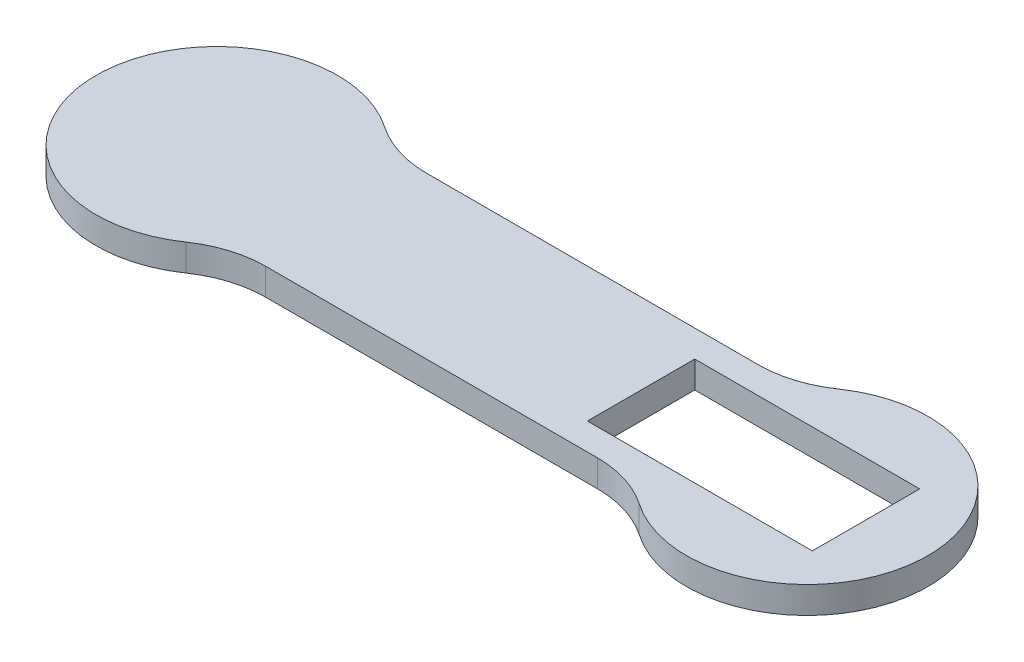
ISO-10303-21;
HEADER;
FILE_DESCRIPTION(('STEP AP214'),'2;1');
FILE_NAME('part.step','',(''),(''),'','','');
FILE_SCHEMA(('AUTOMOTIVE_DESIGN { 1 0 10303 214 1 1 1 1 }'));
ENDSEC;
DATA;
#1=APPLICATION_CONTEXT('core data for automotive mechanical design processes');
#2=APPLICATION_PROTOCOL_DEFINITION('international standard','automotive_design',2000,#1);
#3=PRODUCT_CONTEXT('',#1,'mechanical');
#4=PRODUCT('Part','Part','',(#3));
#5=PRODUCT_RELATED_PRODUCT_CATEGORY('part','',(#4));
#6=PRODUCT_DEFINITION_FORMATION('','',#4);
#7=PRODUCT_DEFINITION_CONTEXT('part definition',#1,'design');
#8=PRODUCT_DEFINITION('design','',#6,#7);
#9=PRODUCT_DEFINITION_SHAPE('','',#8);
#10=(LENGTH_UNIT() NAMED_UNIT(*) SI_UNIT(.MILLI.,.METRE.));
#11=(NAMED_UNIT(*) PLANE_ANGLE_UNIT() SI_UNIT($,.RADIAN.));
#12=(NAMED_UNIT(*) SI_UNIT($,.STERADIAN.) SOLID_ANGLE_UNIT());
#13=UNCERTAINTY_MEASURE_WITH_UNIT(LENGTH_MEASURE(1.E-05),#10,'distance_accuracy_value','');
#14=(GEOMETRIC_REPRESENTATION_CONTEXT(3) GLOBAL_UNCERTAINTY_ASSIGNED_CONTEXT((#13)) GLOBAL_UNIT_ASSIGNED_CONTEXT((#10,
#11,#12)) REPRESENTATION_CONTEXT('',''));
#15=CARTESIAN_POINT('',(0.,0.,0.));
#16=DIRECTION('',(0.,0.,1.));
#17=DIRECTION('',(1.,0.,0.));
#18=AXIS2_PLACEMENT_3D('',#15,#16,#17);
#19=CARTESIAN_POINT('',(85.8908730975176,5.,35.));
#20=DIRECTION('',(0.,-1.,0.));
#21=DIRECTION('',(0.,0.,-1.));
#22=AXIS2_PLACEMENT_3D('',#19,#20,#21);
#23=CYLINDRICAL_SURFACE('',#22,20.);
#24=CARTESIAN_POINT('',(85.8908730975176,0.,35.));
#25=DIRECTION('',(0.,-1.,0.));
#26=DIRECTION('',(0.,0.,1.));
#27=AXIS2_PLACEMENT_3D('',#24,#25,#26);
#28=CIRCLE('',#27,20.);
#29=CARTESIAN_POINT('',(85.8908730975176,0.,15.));
#30=VERTEX_POINT('',#29);
#31=CARTESIAN_POINT('',(97.2363445810388,0.,18.5294117647059));
#32=VERTEX_POINT('',#31);
#33=EDGE_CURVE('E153',#30,#32,#28,.T.);
#34=ORIENTED_EDGE('',*,*,#33,.T.);
#35=DIRECTION('',(0.,-1.,0.));
#36=VECTOR('',#35,1.);
#37=CARTESIAN_POINT('',(97.2363445810388,5.,18.5294117647059));
#38=LINE('',#37,#36);
#39=CARTESIAN_POINT('',(97.2363445810388,5.,18.5294117647059));
#40=VERTEX_POINT('',#39);
#41=EDGE_CURVE('E11',#40,#32,#38,.T.);
#42=ORIENTED_EDGE('',*,*,#41,.F.);
#43=CARTESIAN_POINT('',(85.8908730975176,5.,35.));
#44=DIRECTION('',(0.,-1.,0.));
#45=DIRECTION('',(0.,0.,1.));
#46=AXIS2_PLACEMENT_3D('',#43,#44,#45);
#47=CIRCLE('',#46,20.);
#48=CARTESIAN_POINT('',(85.8908730975176,5.,15.));
#49=VERTEX_POINT('',#48);
#50=EDGE_CURVE('E157',#49,#40,#47,.T.);
#51=ORIENTED_EDGE('',*,*,#50,.F.);
#52=DIRECTION('',(0.,-1.,0.));
#53=VECTOR('',#52,1.);
#54=CARTESIAN_POINT('',(85.8908730975176,5.,15.));
#55=LINE('',#54,#53);
#56=EDGE_CURVE('E175',#49,#30,#55,.T.);
#57=ORIENTED_EDGE('',*,*,#56,.T.);
#58=EDGE_LOOP('',(#34,#42,#51,#57));
#59=FACE_BOUND('',#58,.T.);
#60=ADVANCED_FACE('F34',(#59),#23,.F.);
#61=CARTESIAN_POINT('',(110.,5.,0.));
#62=DIRECTION('',(0.,-1.,0.));
#63=DIRECTION('',(0.,0.,-1.));
#64=AXIS2_PLACEMENT_3D('',#61,#62,#63);
#65=CYLINDRICAL_SURFACE('',#64,22.5);
#66=CARTESIAN_POINT('',(110.,0.,0.));
#67=DIRECTION('',(0.,1.,0.));
#68=DIRECTION('',(0.,0.,1.));
#69=AXIS2_PLACEMENT_3D('',#66,#67,#68);
#70=CIRCLE('',#69,22.5);
#71=CARTESIAN_POINT('',(97.2363445810388,0.,-18.5294117647059));
#72=VERTEX_POINT('',#71);
#73=EDGE_CURVE('E178',#32,#72,#70,.T.);
#74=ORIENTED_EDGE('',*,*,#73,.T.);
#75=DIRECTION('',(0.,-1.,0.));
#76=VECTOR('',#75,1.);
#77=CARTESIAN_POINT('',(97.2363445810388,5.,-18.5294117647059));
#78=LINE('',#77,#76);
#79=CARTESIAN_POINT('',(97.2363445810388,5.,-18.5294117647059));
#80=VERTEX_POINT('',#79);
#81=EDGE_CURVE('E41',#80,#72,#78,.T.);
#82=ORIENTED_EDGE('',*,*,#81,.F.);
#83=CARTESIAN_POINT('',(110.,5.,0.));
#84=DIRECTION('',(0.,1.,0.));
#85=DIRECTION('',(0.,0.,1.));
#86=AXIS2_PLACEMENT_3D('',#83,#84,#85);
#87=CIRCLE('',#86,22.5);
#88=EDGE_CURVE('E160',#40,#80,#87,.T.);
#89=ORIENTED_EDGE('',*,*,#88,.F.);
#90=ORIENTED_EDGE('',*,*,#41,.T.);
#91=EDGE_LOOP('',(#74,#82,#89,#90));
#92=FACE_BOUND('',#91,.T.);
#93=ADVANCED_FACE('F233',(#92),#65,.T.);
#94=CARTESIAN_POINT('',(85.8908730975176,5.,-35.));
#95=DIRECTION('',(0.,-1.,0.));
#96=DIRECTION('',(0.,0.,-1.));
#97=AXIS2_PLACEMENT_3D('',#94,#95,#96);
#98=CYLINDRICAL_SURFACE('',#97,20.);
#99=CARTESIAN_POINT('',(85.8908730975176,0.,-35.));
#100=DIRECTION('',(0.,-1.,0.));
#101=DIRECTION('',(0.,0.,-1.));
#102=AXIS2_PLACEMENT_3D('',#99,#100,#101);
#103=CIRCLE('',#102,20.);
#104=CARTESIAN_POINT('',(85.8908730975176,0.,-15.));
#105=VERTEX_POINT('',#104);
#106=EDGE_CURVE('E180',#72,#105,#103,.T.);
#107=ORIENTED_EDGE('',*,*,#106,.T.);
#108=DIRECTION('',(0.,-1.,0.));
#109=VECTOR('',#108,1.);
#110=CARTESIAN_POINT('',(85.8908730975176,5.,-15.));
#111=LINE('',#110,#109);
#112=CARTESIAN_POINT('',(85.8908730975176,5.,-15.));
#113=VERTEX_POINT('',#112);
#114=EDGE_CURVE('E205',#113,#105,#111,.T.);
#115=ORIENTED_EDGE('',*,*,#114,.F.);
#116=CARTESIAN_POINT('',(85.8908730975176,5.,-35.));
#117=DIRECTION('',(0.,-1.,0.));
#118=DIRECTION('',(0.,0.,-1.));
#119=AXIS2_PLACEMENT_3D('',#116,#117,#118);
#120=CIRCLE('',#119,20.);
#121=EDGE_CURVE('E163',#80,#113,#120,.T.);
#122=ORIENTED_EDGE('',*,*,#121,.F.);
#123=ORIENTED_EDGE('',*,*,#81,.T.);
#124=EDGE_LOOP('',(#107,#115,#122,#123));
#125=FACE_BOUND('',#124,.T.);
#126=ADVANCED_FACE('F212',(#125),#98,.F.);
#127=CARTESIAN_POINT('',(24.1091269024824,5.,-15.));
#128=DIRECTION('',(0.,0.,1.));
#129=DIRECTION('',(1.,0.,0.));
#130=AXIS2_PLACEMENT_3D('',#127,#128,#129);
#131=PLANE('',#130);
#132=DIRECTION('',(-1.,0.,0.));
#133=VECTOR('',#132,1.);
#134=CARTESIAN_POINT('',(24.1091269024824,0.,-15.));
#135=LINE('',#134,#133);
#136=CARTESIAN_POINT('',(24.1091269024824,0.,-15.));
#137=VERTEX_POINT('',#136);
#138=EDGE_CURVE('E182',#105,#137,#135,.T.);
#139=ORIENTED_EDGE('',*,*,#138,.T.);
#140=DIRECTION('',(0.,-1.,0.));
#141=VECTOR('',#140,1.);
#142=CARTESIAN_POINT('',(24.1091269024824,5.,-15.));
#143=LINE('',#142,#141);
#144=CARTESIAN_POINT('',(24.1091269024824,5.,-15.));
#145=VERTEX_POINT('',#144);
#146=EDGE_CURVE('E202',#145,#137,#143,.T.);
#147=ORIENTED_EDGE('',*,*,#146,.F.);
#148=DIRECTION('',(-1.,0.,0.));
#149=VECTOR('',#148,1.);
#150=CARTESIAN_POINT('',(24.1091269024824,5.,-15.));
#151=LINE('',#150,#149);
#152=EDGE_CURVE('E165',#113,#145,#151,.T.);
#153=ORIENTED_EDGE('',*,*,#152,.F.);
#154=ORIENTED_EDGE('',*,*,#114,.T.);
#155=EDGE_LOOP('',(#139,#147,#153,#154));
#156=FACE_BOUND('',#155,.T.);
#157=ADVANCED_FACE('F221',(#156),#131,.F.);
#158=CARTESIAN_POINT('',(24.1091269024824,5.,-35.));
#159=DIRECTION('',(0.,-1.,0.));
#160=DIRECTION('',(0.,0.,-1.));
#161=AXIS2_PLACEMENT_3D('',#158,#159,#160);
#162=CYLINDRICAL_SURFACE('',#161,20.);
#163=CARTESIAN_POINT('',(24.1091269024824,0.,-35.));
#164=DIRECTION('',(0.,-1.,0.));
#165=DIRECTION('',(0.,0.,-1.));
#166=AXIS2_PLACEMENT_3D('',#163,#164,#165);
#167=CIRCLE('',#166,20.);
#168=CARTESIAN_POINT('',(12.7636554189613,0.,-18.5294117647059));
#169=VERTEX_POINT('',#168);
#170=EDGE_CURVE('E184',#137,#169,#167,.T.);
#171=ORIENTED_EDGE('',*,*,#170,.T.);
#172=DIRECTION('',(0.,-1.,0.));
#173=VECTOR('',#172,1.);
#174=CARTESIAN_POINT('',(12.7636554189613,5.,-18.5294117647059));
#175=LINE('',#174,#173);
#176=CARTESIAN_POINT('',(12.7636554189613,5.,-18.5294117647059));
#177=VERTEX_POINT('',#176);
#178=EDGE_CURVE('E199',#177,#169,#175,.T.);
#179=ORIENTED_EDGE('',*,*,#178,.F.);
#180=CARTESIAN_POINT('',(24.1091269024824,5.,-35.));
#181=DIRECTION('',(0.,-1.,0.));
#182=DIRECTION('',(0.,0.,-1.));
#183=AXIS2_PLACEMENT_3D('',#180,#181,#182);
#184=CIRCLE('',#183,20.);
#185=EDGE_CURVE('E167',#145,#177,#184,.T.);
#186=ORIENTED_EDGE('',*,*,#185,.F.);
#187=ORIENTED_EDGE('',*,*,#146,.T.);
#188=EDGE_LOOP('',(#171,#179,#186,#187));
#189=FACE_BOUND('',#188,.T.);
#190=ADVANCED_FACE('F225',(#189),#162,.F.);
#191=CARTESIAN_POINT('',(0.,5.,0.));
#192=DIRECTION('',(0.,-1.,0.));
#193=DIRECTION('',(0.,0.,-1.));
#194=AXIS2_PLACEMENT_3D('',#191,#192,#193);
#195=CYLINDRICAL_SURFACE('',#194,22.5);
#196=CARTESIAN_POINT('',(0.,0.,0.));
#197=DIRECTION('',(0.,1.,0.));
#198=DIRECTION('',(0.,0.,1.));
#199=AXIS2_PLACEMENT_3D('',#196,#197,#198);
#200=CIRCLE('',#199,22.5);
#201=CARTESIAN_POINT('',(12.7636554189613,0.,18.5294117647059));
#202=VERTEX_POINT('',#201);
#203=EDGE_CURVE('E186',#169,#202,#200,.T.);
#204=ORIENTED_EDGE('',*,*,#203,.T.);
#205=DIRECTION('',(0.,-1.,0.));
#206=VECTOR('',#205,1.);
#207=CARTESIAN_POINT('',(12.7636554189613,5.,18.5294117647059));
#208=LINE('',#207,#206);
#209=CARTESIAN_POINT('',(12.7636554189613,5.,18.5294117647059));
#210=VERTEX_POINT('',#209);
#211=EDGE_CURVE('E196',#210,#202,#208,.T.);
#212=ORIENTED_EDGE('',*,*,#211,.F.);
#213=CARTESIAN_POINT('',(0.,5.,0.));
#214=DIRECTION('',(0.,1.,0.));
#215=DIRECTION('',(0.,0.,1.));
#216=AXIS2_PLACEMENT_3D('',#213,#214,#215);
#217=CIRCLE('',#216,22.5);
#218=EDGE_CURVE('E169',#177,#210,#217,.T.);
#219=ORIENTED_EDGE('',*,*,#218,.F.);
#220=ORIENTED_EDGE('',*,*,#178,.T.);
#221=EDGE_LOOP('',(#204,#212,#219,#220));
#222=FACE_BOUND('',#221,.T.);
#223=ADVANCED_FACE('F246',(#222),#195,.T.);
#224=CARTESIAN_POINT('',(24.1091269024824,5.,35.));
#225=DIRECTION('',(0.,-1.,0.));
#226=DIRECTION('',(0.,0.,-1.));
#227=AXIS2_PLACEMENT_3D('',#224,#225,#226);
#228=CYLINDRICAL_SURFACE('',#227,20.);
#229=CARTESIAN_POINT('',(24.1091269024824,0.,35.));
#230=DIRECTION('',(0.,-1.,0.));
#231=DIRECTION('',(0.,0.,1.));
#232=AXIS2_PLACEMENT_3D('',#229,#230,#231);
#233=CIRCLE('',#232,20.);
#234=CARTESIAN_POINT('',(24.1091269024824,0.,15.));
#235=VERTEX_POINT('',#234);
#236=EDGE_CURVE('E188',#202,#235,#233,.T.);
#237=ORIENTED_EDGE('',*,*,#236,.T.);
#238=DIRECTION('',(0.,-1.,0.));
#239=VECTOR('',#238,1.);
#240=CARTESIAN_POINT('',(24.1091269024824,5.,15.));
#241=LINE('',#240,#239);
#242=CARTESIAN_POINT('',(24.1091269024824,5.,15.));
#243=VERTEX_POINT('',#242);
#244=EDGE_CURVE('E193',#243,#235,#241,.T.);
#245=ORIENTED_EDGE('',*,*,#244,.F.);
#246=CARTESIAN_POINT('',(24.1091269024824,5.,35.));
#247=DIRECTION('',(0.,-1.,0.));
#248=DIRECTION('',(0.,0.,1.));
#249=AXIS2_PLACEMENT_3D('',#246,#247,#248);
#250=CIRCLE('',#249,20.);
#251=EDGE_CURVE('E171',#210,#243,#250,.T.);
#252=ORIENTED_EDGE('',*,*,#251,.F.);
#253=ORIENTED_EDGE('',*,*,#211,.T.);
#254=EDGE_LOOP('',(#237,#245,#252,#253));
#255=FACE_BOUND('',#254,.T.);
#256=ADVANCED_FACE('F244',(#255),#228,.F.);
#257=CARTESIAN_POINT('',(24.1091269024824,5.,15.));
#258=DIRECTION('',(0.,0.,-1.));
#259=DIRECTION('',(-1.,0.,0.));
#260=AXIS2_PLACEMENT_3D('',#257,#258,#259);
#261=PLANE('',#260);
#262=DIRECTION('',(1.,0.,0.));
#263=VECTOR('',#262,1.);
#264=CARTESIAN_POINT('',(24.1091269024824,0.,15.));
#265=LINE('',#264,#263);
#266=EDGE_CURVE('E161',#235,#30,#265,.T.);
#267=ORIENTED_EDGE('',*,*,#266,.T.);
#268=ORIENTED_EDGE('',*,*,#56,.F.);
#269=DIRECTION('',(1.,0.,0.));
#270=VECTOR('',#269,1.);
#271=CARTESIAN_POINT('',(24.1091269024824,5.,15.));
#272=LINE('',#271,#270);
#273=EDGE_CURVE('E173',#243,#49,#272,.T.);
#274=ORIENTED_EDGE('',*,*,#273,.F.);
#275=ORIENTED_EDGE('',*,*,#244,.T.);
#276=EDGE_LOOP('',(#267,#268,#274,#275));
#277=FACE_BOUND('',#276,.T.);
#278=ADVANCED_FACE('F239',(#277),#261,.F.);
#279=CARTESIAN_POINT('',(85.8908730975176,5.,35.));
#280=DIRECTION('',(0.,1.,0.));
#281=DIRECTION('',(0.,0.,1.));
#282=AXIS2_PLACEMENT_3D('',#279,#280,#281);
#283=PLANE('',#282);
#284=DIRECTION('',(1.,0.,0.));
#285=VECTOR('',#284,1.);
#286=CARTESIAN_POINT('',(0.,5.,10.));
#287=LINE('',#286,#285);
#288=CARTESIAN_POINT('',(79.05,5.,10.));
#289=VERTEX_POINT('',#288);
#290=CARTESIAN_POINT('',(120.95,5.,10.));
#291=VERTEX_POINT('',#290);
#292=EDGE_CURVE('E48',#289,#291,#287,.T.);
#293=ORIENTED_EDGE('',*,*,#292,.F.);
#294=DIRECTION('',(0.,0.,-1.));
#295=VECTOR('',#294,1.);
#296=CARTESIAN_POINT('',(79.05,5.,0.));
#297=LINE('',#296,#295);
#298=CARTESIAN_POINT('',(79.05,5.,-10.));
#299=VERTEX_POINT('',#298);
#300=EDGE_CURVE('E138',#289,#299,#297,.T.);
#301=ORIENTED_EDGE('',*,*,#300,.T.);
#302=DIRECTION('',(1.,0.,0.));
#303=VECTOR('',#302,1.);
#304=CARTESIAN_POINT('',(0.,5.,-10.));
#305=LINE('',#304,#303);
#306=CARTESIAN_POINT('',(120.95,5.,-10.));
#307=VERTEX_POINT('',#306);
#308=EDGE_CURVE('E141',#299,#307,#305,.T.);
#309=ORIENTED_EDGE('',*,*,#308,.T.);
#310=DIRECTION('',(0.,0.,-1.));
#311=VECTOR('',#310,1.);
#312=CARTESIAN_POINT('',(120.95,5.,0.));
#313=LINE('',#312,#311);
#314=EDGE_CURVE('E147',#291,#307,#313,.T.);
#315=ORIENTED_EDGE('',*,*,#314,.F.);
#316=EDGE_LOOP('',(#293,#301,#309,#315));
#317=FACE_BOUND('',#316,.T.);
#318=ORIENTED_EDGE('',*,*,#50,.T.);
#319=ORIENTED_EDGE('',*,*,#88,.T.);
#320=ORIENTED_EDGE('',*,*,#121,.T.);
#321=ORIENTED_EDGE('',*,*,#152,.T.);
#322=ORIENTED_EDGE('',*,*,#185,.T.);
#323=ORIENTED_EDGE('',*,*,#218,.T.);
#324=ORIENTED_EDGE('',*,*,#251,.T.);
#325=ORIENTED_EDGE('',*,*,#273,.T.);
#326=EDGE_LOOP('',(#318,#319,#320,#321,#322,#323,#324,#325));
#327=FACE_BOUND('',#326,.T.);
#328=ADVANCED_FACE('F229',(#317,#327),#283,.T.);
#329=CARTESIAN_POINT('',(85.8908730975176,0.,35.));
#330=DIRECTION('',(0.,1.,0.));
#331=DIRECTION('',(0.,0.,1.));
#332=AXIS2_PLACEMENT_3D('',#329,#330,#331);
#333=PLANE('',#332);
#334=DIRECTION('',(0.,0.,-1.));
#335=VECTOR('',#334,1.);
#336=CARTESIAN_POINT('',(79.05,0.,0.));
#337=LINE('',#336,#335);
#338=CARTESIAN_POINT('',(79.05,0.,10.));
#339=VERTEX_POINT('',#338);
#340=CARTESIAN_POINT('',(79.05,0.,-10.));
#341=VERTEX_POINT('',#340);
#342=EDGE_CURVE('E127',#339,#341,#337,.T.);
#343=ORIENTED_EDGE('',*,*,#342,.F.);
#344=DIRECTION('',(1.,0.,0.));
#345=VECTOR('',#344,1.);
#346=CARTESIAN_POINT('',(0.,0.,10.));
#347=LINE('',#346,#345);
#348=CARTESIAN_POINT('',(120.95,0.,10.));
#349=VERTEX_POINT('',#348);
#350=EDGE_CURVE('E124',#339,#349,#347,.T.);
#351=ORIENTED_EDGE('',*,*,#350,.T.);
#352=DIRECTION('',(0.,0.,-1.));
#353=VECTOR('',#352,1.);
#354=CARTESIAN_POINT('',(120.95,0.,0.));
#355=LINE('',#354,#353);
#356=CARTESIAN_POINT('',(120.95,0.,-9.99999999999999));
#357=VERTEX_POINT('',#356);
#358=EDGE_CURVE('E130',#349,#357,#355,.T.);
#359=ORIENTED_EDGE('',*,*,#358,.T.);
#360=DIRECTION('',(1.,0.,0.));
#361=VECTOR('',#360,1.);
#362=CARTESIAN_POINT('',(0.,0.,-10.));
#363=LINE('',#362,#361);
#364=EDGE_CURVE('E134',#341,#357,#363,.T.);
#365=ORIENTED_EDGE('',*,*,#364,.F.);
#366=EDGE_LOOP('',(#343,#351,#359,#365));
#367=FACE_BOUND('',#366,.T.);
#368=ORIENTED_EDGE('',*,*,#33,.F.);
#369=ORIENTED_EDGE('',*,*,#266,.F.);
#370=ORIENTED_EDGE('',*,*,#236,.F.);
#371=ORIENTED_EDGE('',*,*,#203,.F.);
#372=ORIENTED_EDGE('',*,*,#170,.F.);
#373=ORIENTED_EDGE('',*,*,#138,.F.);
#374=ORIENTED_EDGE('',*,*,#106,.F.);
#375=ORIENTED_EDGE('',*,*,#73,.F.);
#376=EDGE_LOOP('',(#368,#369,#370,#371,#372,#373,#374,#375));
#377=FACE_BOUND('',#376,.T.);
#378=ADVANCED_FACE('F136',(#367,#377),#333,.F.);
#379=CARTESIAN_POINT('',(0.,0.,10.));
#380=DIRECTION('',(0.,0.,1.));
#381=DIRECTION('',(1.,0.,0.));
#382=AXIS2_PLACEMENT_3D('',#379,#380,#381);
#383=PLANE('',#382);
#384=ORIENTED_EDGE('',*,*,#292,.T.);
#385=DIRECTION('',(0.,1.,0.));
#386=VECTOR('',#385,1.);
#387=CARTESIAN_POINT('',(120.95,0.,10.));
#388=LINE('',#387,#386);
#389=EDGE_CURVE('E121',#349,#291,#388,.T.);
#390=ORIENTED_EDGE('',*,*,#389,.F.);
#391=ORIENTED_EDGE('',*,*,#350,.F.);
#392=DIRECTION('',(0.,1.,0.));
#393=VECTOR('',#392,1.);
#394=CARTESIAN_POINT('',(79.05,0.,10.));
#395=LINE('',#394,#393);
#396=EDGE_CURVE('E151',#339,#289,#395,.T.);
#397=ORIENTED_EDGE('',*,*,#396,.T.);
#398=EDGE_LOOP('',(#384,#390,#391,#397));
#399=FACE_BOUND('',#398,.T.);
#400=ADVANCED_FACE('F122',(#399),#383,.F.);
#401=CARTESIAN_POINT('',(79.05,0.,0.));
#402=DIRECTION('',(1.,0.,0.));
#403=DIRECTION('',(0.,0.,-1.));
#404=AXIS2_PLACEMENT_3D('',#401,#402,#403);
#405=PLANE('',#404);
#406=ORIENTED_EDGE('',*,*,#300,.F.);
#407=ORIENTED_EDGE('',*,*,#396,.F.);
#408=ORIENTED_EDGE('',*,*,#342,.T.);
#409=DIRECTION('',(0.,1.,0.));
#410=VECTOR('',#409,1.);
#411=CARTESIAN_POINT('',(79.05,0.,-10.));
#412=LINE('',#411,#410);
#413=EDGE_CURVE('E154',#341,#299,#412,.T.);
#414=ORIENTED_EDGE('',*,*,#413,.T.);
#415=EDGE_LOOP('',(#406,#407,#408,#414));
#416=FACE_BOUND('',#415,.T.);
#417=ADVANCED_FACE('F317',(#416),#405,.T.);
#418=CARTESIAN_POINT('',(0.,0.,-10.));
#419=DIRECTION('',(0.,0.,1.));
#420=DIRECTION('',(1.,0.,0.));
#421=AXIS2_PLACEMENT_3D('',#418,#419,#420);
#422=PLANE('',#421);
#423=ORIENTED_EDGE('',*,*,#308,.F.);
#424=ORIENTED_EDGE('',*,*,#413,.F.);
#425=ORIENTED_EDGE('',*,*,#364,.T.);
#426=DIRECTION('',(0.,1.,0.));
#427=VECTOR('',#426,1.);
#428=CARTESIAN_POINT('',(120.95,0.,-10.));
#429=LINE('',#428,#427);
#430=EDGE_CURVE('E56',#357,#307,#429,.T.);
#431=ORIENTED_EDGE('',*,*,#430,.T.);
#432=EDGE_LOOP('',(#423,#424,#425,#431));
#433=FACE_BOUND('',#432,.T.);
#434=ADVANCED_FACE('F326',(#433),#422,.T.);
#435=CARTESIAN_POINT('',(120.95,0.,0.));
#436=DIRECTION('',(1.,0.,0.));
#437=DIRECTION('',(0.,0.,-1.));
#438=AXIS2_PLACEMENT_3D('',#435,#436,#437);
#439=PLANE('',#438);
#440=ORIENTED_EDGE('',*,*,#314,.T.);
#441=ORIENTED_EDGE('',*,*,#430,.F.);
#442=ORIENTED_EDGE('',*,*,#358,.F.);
#443=ORIENTED_EDGE('',*,*,#389,.T.);
#444=EDGE_LOOP('',(#440,#441,#442,#443));
#445=FACE_BOUND('',#444,.T.);
#446=ADVANCED_FACE('F131',(#445),#439,.F.);
#447=CLOSED_SHELL('',(#60,#93,#126,#157,#190,#223,#256,#278,#328,#378,#400,#417,#434,#446));
#448=MANIFOLD_SOLID_BREP('B2',#447);
#449=ADVANCED_BREP_SHAPE_REPRESENTATION('',(#18,#448),#14);
#450=SHAPE_DEFINITION_REPRESENTATION(#9,#449);
ENDSEC;
END-ISO-10303-21;
